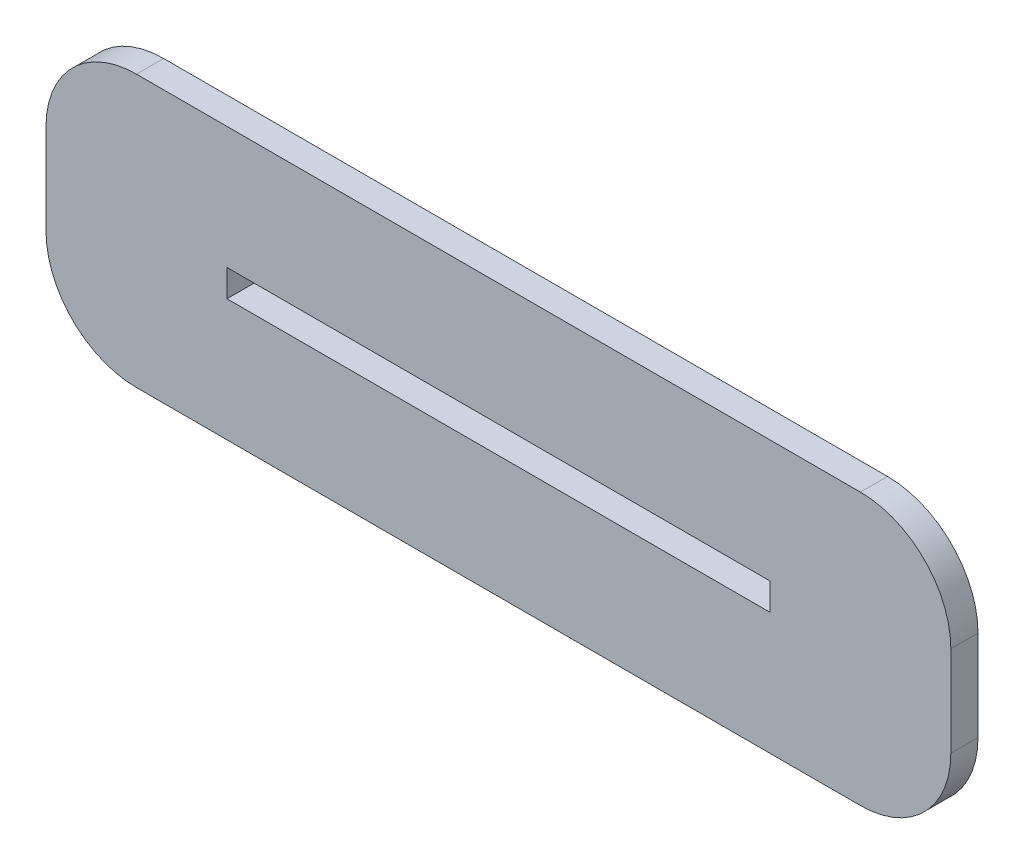
ISO-10303-21;
HEADER;
FILE_DESCRIPTION(('STEP AP214'),'2;1');
FILE_NAME('part.step','',(''),(''),'','','');
FILE_SCHEMA(('AUTOMOTIVE_DESIGN { 1 0 10303 214 1 1 1 1 }'));
ENDSEC;
DATA;
#1=APPLICATION_CONTEXT('core data for automotive mechanical design processes');
#2=APPLICATION_PROTOCOL_DEFINITION('international standard','automotive_design',2000,#1);
#3=PRODUCT_CONTEXT('',#1,'mechanical');
#4=PRODUCT('Part','Part','',(#3));
#5=PRODUCT_RELATED_PRODUCT_CATEGORY('part','',(#4));
#6=PRODUCT_DEFINITION_FORMATION('','',#4);
#7=PRODUCT_DEFINITION_CONTEXT('part definition',#1,'design');
#8=PRODUCT_DEFINITION('design','',#6,#7);
#9=PRODUCT_DEFINITION_SHAPE('','',#8);
#10=(LENGTH_UNIT() NAMED_UNIT(*) SI_UNIT(.MILLI.,.METRE.));
#11=(NAMED_UNIT(*) PLANE_ANGLE_UNIT() SI_UNIT($,.RADIAN.));
#12=(NAMED_UNIT(*) SI_UNIT($,.STERADIAN.) SOLID_ANGLE_UNIT());
#13=UNCERTAINTY_MEASURE_WITH_UNIT(LENGTH_MEASURE(1.E-05),#10,'distance_accuracy_value','');
#14=(GEOMETRIC_REPRESENTATION_CONTEXT(3) GLOBAL_UNCERTAINTY_ASSIGNED_CONTEXT((#13)) GLOBAL_UNIT_ASSIGNED_CONTEXT((#10,
#11,#12)) REPRESENTATION_CONTEXT('',''));
#15=CARTESIAN_POINT('',(0.,0.,0.));
#16=DIRECTION('',(0.,0.,1.));
#17=DIRECTION('',(1.,0.,0.));
#18=AXIS2_PLACEMENT_3D('',#15,#16,#17);
#19=CARTESIAN_POINT('',(0.,30.,3.));
#20=DIRECTION('',(0.,0.,-1.));
#21=DIRECTION('',(-1.,0.,0.));
#22=AXIS2_PLACEMENT_3D('',#19,#20,#21);
#23=PLANE('',#22);
#24=DIRECTION('',(-1.,0.,0.));
#25=VECTOR('',#24,1.);
#26=CARTESIAN_POINT('',(0.,30.,3.));
#27=LINE('',#26,#25);
#28=CARTESIAN_POINT('',(90.,30.,3.));
#29=VERTEX_POINT('',#28);
#30=CARTESIAN_POINT('',(10.,30.,3.));
#31=VERTEX_POINT('',#30);
#32=EDGE_CURVE('E171',#29,#31,#27,.T.);
#33=ORIENTED_EDGE('',*,*,#32,.T.);
#34=CARTESIAN_POINT('',(10.,20.,3.));
#35=DIRECTION('',(0.,0.,-1.));
#36=DIRECTION('',(-1.,0.,0.));
#37=AXIS2_PLACEMENT_3D('',#34,#35,#36);
#38=CIRCLE('',#37,10.);
#39=CARTESIAN_POINT('',(0.,20.,3.));
#40=VERTEX_POINT('',#39);
#41=EDGE_CURVE('E206',#31,#40,#38,.F.);
#42=ORIENTED_EDGE('',*,*,#41,.T.);
#43=DIRECTION('',(0.,-1.,0.));
#44=VECTOR('',#43,1.);
#45=CARTESIAN_POINT('',(0.,0.,3.));
#46=LINE('',#45,#44);
#47=CARTESIAN_POINT('',(0.,10.,3.));
#48=VERTEX_POINT('',#47);
#49=EDGE_CURVE('E163',#40,#48,#46,.T.);
#50=ORIENTED_EDGE('',*,*,#49,.T.);
#51=CARTESIAN_POINT('',(10.,10.,3.));
#52=DIRECTION('',(0.,0.,-1.));
#53=DIRECTION('',(-1.,0.,0.));
#54=AXIS2_PLACEMENT_3D('',#51,#52,#53);
#55=CIRCLE('',#54,10.);
#56=CARTESIAN_POINT('',(10.,0.,3.));
#57=VERTEX_POINT('',#56);
#58=EDGE_CURVE('E204',#48,#57,#55,.F.);
#59=ORIENTED_EDGE('',*,*,#58,.T.);
#60=DIRECTION('',(1.,0.,0.));
#61=VECTOR('',#60,1.);
#62=CARTESIAN_POINT('',(0.,0.,3.));
#63=LINE('',#62,#61);
#64=CARTESIAN_POINT('',(90.,0.,3.));
#65=VERTEX_POINT('',#64);
#66=EDGE_CURVE('E166',#57,#65,#63,.T.);
#67=ORIENTED_EDGE('',*,*,#66,.T.);
#68=CARTESIAN_POINT('',(90.,10.,3.));
#69=DIRECTION('',(0.,0.,-1.));
#70=DIRECTION('',(-1.,0.,0.));
#71=AXIS2_PLACEMENT_3D('',#68,#69,#70);
#72=CIRCLE('',#71,10.);
#73=CARTESIAN_POINT('',(100.,10.,3.));
#74=VERTEX_POINT('',#73);
#75=EDGE_CURVE('E52',#65,#74,#72,.F.);
#76=ORIENTED_EDGE('',*,*,#75,.T.);
#77=DIRECTION('',(0.,1.,0.));
#78=VECTOR('',#77,1.);
#79=CARTESIAN_POINT('',(100.,0.,3.));
#80=LINE('',#79,#78);
#81=CARTESIAN_POINT('',(100.,20.,3.));
#82=VERTEX_POINT('',#81);
#83=EDGE_CURVE('E169',#74,#82,#80,.T.);
#84=ORIENTED_EDGE('',*,*,#83,.T.);
#85=CARTESIAN_POINT('',(90.,20.,3.));
#86=DIRECTION('',(0.,0.,-1.));
#87=DIRECTION('',(-1.,0.,0.));
#88=AXIS2_PLACEMENT_3D('',#85,#86,#87);
#89=CIRCLE('',#88,10.);
#90=EDGE_CURVE('E201',#82,#29,#89,.F.);
#91=ORIENTED_EDGE('',*,*,#90,.T.);
#92=EDGE_LOOP('',(#33,#42,#50,#59,#67,#76,#84,#91));
#93=FACE_BOUND('',#92,.T.);
#94=DIRECTION('',(0.,1.,0.));
#95=VECTOR('',#94,1.);
#96=CARTESIAN_POINT('',(80.,13.5,3.));
#97=LINE('',#96,#95);
#98=CARTESIAN_POINT('',(80.,13.5,3.));
#99=VERTEX_POINT('',#98);
#100=CARTESIAN_POINT('',(80.,16.5,3.));
#101=VERTEX_POINT('',#100);
#102=EDGE_CURVE('E122',#99,#101,#97,.T.);
#103=ORIENTED_EDGE('',*,*,#102,.F.);
#104=DIRECTION('',(1.,0.,0.));
#105=VECTOR('',#104,1.);
#106=CARTESIAN_POINT('',(20.,13.5,3.));
#107=LINE('',#106,#105);
#108=CARTESIAN_POINT('',(20.,13.5,3.));
#109=VERTEX_POINT('',#108);
#110=EDGE_CURVE('E147',#109,#99,#107,.T.);
#111=ORIENTED_EDGE('',*,*,#110,.F.);
#112=DIRECTION('',(0.,-1.,0.));
#113=VECTOR('',#112,1.);
#114=CARTESIAN_POINT('',(20.,13.5,3.));
#115=LINE('',#114,#113);
#116=CARTESIAN_POINT('',(20.,16.5,3.));
#117=VERTEX_POINT('',#116);
#118=EDGE_CURVE('E145',#117,#109,#115,.T.);
#119=ORIENTED_EDGE('',*,*,#118,.F.);
#120=DIRECTION('',(-1.,0.,0.));
#121=VECTOR('',#120,1.);
#122=CARTESIAN_POINT('',(20.,16.5,3.));
#123=LINE('',#122,#121);
#124=EDGE_CURVE('E132',#101,#117,#123,.T.);
#125=ORIENTED_EDGE('',*,*,#124,.F.);
#126=EDGE_LOOP('',(#103,#111,#119,#125));
#127=FACE_BOUND('',#126,.T.);
#128=ADVANCED_FACE('F31',(#93,#127),#23,.F.);
#129=CARTESIAN_POINT('',(0.,30.,0.));
#130=DIRECTION('',(0.,0.,-1.));
#131=DIRECTION('',(-1.,0.,0.));
#132=AXIS2_PLACEMENT_3D('',#129,#130,#131);
#133=PLANE('',#132);
#134=DIRECTION('',(0.,-1.,0.));
#135=VECTOR('',#134,1.);
#136=CARTESIAN_POINT('',(0.,0.,0.));
#137=LINE('',#136,#135);
#138=CARTESIAN_POINT('',(0.,20.,0.));
#139=VERTEX_POINT('',#138);
#140=CARTESIAN_POINT('',(0.,10.,0.));
#141=VERTEX_POINT('',#140);
#142=EDGE_CURVE('E140',#139,#141,#137,.T.);
#143=ORIENTED_EDGE('',*,*,#142,.F.);
#144=CARTESIAN_POINT('',(10.,20.,0.));
#145=DIRECTION('',(0.,0.,-1.));
#146=DIRECTION('',(-1.,0.,0.));
#147=AXIS2_PLACEMENT_3D('',#144,#145,#146);
#148=CIRCLE('',#147,10.);
#149=CARTESIAN_POINT('',(10.,30.,0.));
#150=VERTEX_POINT('',#149);
#151=EDGE_CURVE('E194',#139,#150,#148,.T.);
#152=ORIENTED_EDGE('',*,*,#151,.T.);
#153=DIRECTION('',(-1.,0.,0.));
#154=VECTOR('',#153,1.);
#155=CARTESIAN_POINT('',(0.,30.,0.));
#156=LINE('',#155,#154);
#157=CARTESIAN_POINT('',(90.,30.,0.));
#158=VERTEX_POINT('',#157);
#159=EDGE_CURVE('E167',#158,#150,#156,.T.);
#160=ORIENTED_EDGE('',*,*,#159,.F.);
#161=CARTESIAN_POINT('',(90.,20.,0.));
#162=DIRECTION('',(0.,0.,-1.));
#163=DIRECTION('',(-1.,0.,0.));
#164=AXIS2_PLACEMENT_3D('',#161,#162,#163);
#165=CIRCLE('',#164,10.);
#166=CARTESIAN_POINT('',(100.,20.,0.));
#167=VERTEX_POINT('',#166);
#168=EDGE_CURVE('E188',#158,#167,#165,.T.);
#169=ORIENTED_EDGE('',*,*,#168,.T.);
#170=DIRECTION('',(0.,1.,0.));
#171=VECTOR('',#170,1.);
#172=CARTESIAN_POINT('',(100.,0.,0.));
#173=LINE('',#172,#171);
#174=CARTESIAN_POINT('',(100.,10.,0.));
#175=VERTEX_POINT('',#174);
#176=EDGE_CURVE('E180',#175,#167,#173,.T.);
#177=ORIENTED_EDGE('',*,*,#176,.F.);
#178=CARTESIAN_POINT('',(90.,10.,0.));
#179=DIRECTION('',(0.,0.,-1.));
#180=DIRECTION('',(-1.,0.,0.));
#181=AXIS2_PLACEMENT_3D('',#178,#179,#180);
#182=CIRCLE('',#181,10.);
#183=CARTESIAN_POINT('',(90.,0.,0.));
#184=VERTEX_POINT('',#183);
#185=EDGE_CURVE('E190',#175,#184,#182,.T.);
#186=ORIENTED_EDGE('',*,*,#185,.T.);
#187=DIRECTION('',(1.,0.,0.));
#188=VECTOR('',#187,1.);
#189=CARTESIAN_POINT('',(0.,0.,0.));
#190=LINE('',#189,#188);
#191=CARTESIAN_POINT('',(10.,0.,0.));
#192=VERTEX_POINT('',#191);
#193=EDGE_CURVE('E177',#192,#184,#190,.T.);
#194=ORIENTED_EDGE('',*,*,#193,.F.);
#195=CARTESIAN_POINT('',(10.,10.,0.));
#196=DIRECTION('',(0.,0.,-1.));
#197=DIRECTION('',(-1.,0.,0.));
#198=AXIS2_PLACEMENT_3D('',#195,#196,#197);
#199=CIRCLE('',#198,10.);
#200=EDGE_CURVE('E192',#192,#141,#199,.T.);
#201=ORIENTED_EDGE('',*,*,#200,.T.);
#202=EDGE_LOOP('',(#143,#152,#160,#169,#177,#186,#194,#201));
#203=FACE_BOUND('',#202,.T.);
#204=DIRECTION('',(1.,0.,0.));
#205=VECTOR('',#204,1.);
#206=CARTESIAN_POINT('',(20.,13.5,0.));
#207=LINE('',#206,#205);
#208=CARTESIAN_POINT('',(20.,13.5,0.));
#209=VERTEX_POINT('',#208);
#210=CARTESIAN_POINT('',(80.,13.5,0.));
#211=VERTEX_POINT('',#210);
#212=EDGE_CURVE('E133',#209,#211,#207,.T.);
#213=ORIENTED_EDGE('',*,*,#212,.T.);
#214=DIRECTION('',(0.,1.,0.));
#215=VECTOR('',#214,1.);
#216=CARTESIAN_POINT('',(80.,13.5,0.));
#217=LINE('',#216,#215);
#218=CARTESIAN_POINT('',(80.,16.5,0.));
#219=VERTEX_POINT('',#218);
#220=EDGE_CURVE('E151',#211,#219,#217,.T.);
#221=ORIENTED_EDGE('',*,*,#220,.T.);
#222=DIRECTION('',(-1.,0.,0.));
#223=VECTOR('',#222,1.);
#224=CARTESIAN_POINT('',(20.,16.5,0.));
#225=LINE('',#224,#223);
#226=CARTESIAN_POINT('',(20.,16.5,0.));
#227=VERTEX_POINT('',#226);
#228=EDGE_CURVE('E139',#219,#227,#225,.T.);
#229=ORIENTED_EDGE('',*,*,#228,.T.);
#230=DIRECTION('',(0.,-1.,0.));
#231=VECTOR('',#230,1.);
#232=CARTESIAN_POINT('',(20.,13.5,0.));
#233=LINE('',#232,#231);
#234=EDGE_CURVE('E154',#227,#209,#233,.T.);
#235=ORIENTED_EDGE('',*,*,#234,.T.);
#236=EDGE_LOOP('',(#213,#221,#229,#235));
#237=FACE_BOUND('',#236,.T.);
#238=ADVANCED_FACE('F222',(#203,#237),#133,.T.);
#239=CARTESIAN_POINT('',(0.,0.,3.));
#240=DIRECTION('',(1.,0.,0.));
#241=DIRECTION('',(0.,0.,-1.));
#242=AXIS2_PLACEMENT_3D('',#239,#240,#241);
#243=PLANE('',#242);
#244=ORIENTED_EDGE('',*,*,#49,.F.);
#245=DIRECTION('',(0.,0.,-1.));
#246=VECTOR('',#245,1.);
#247=CARTESIAN_POINT('',(0.,20.,3.));
#248=LINE('',#247,#246);
#249=EDGE_CURVE('E185',#40,#139,#248,.T.);
#250=ORIENTED_EDGE('',*,*,#249,.T.);
#251=ORIENTED_EDGE('',*,*,#142,.T.);
#252=DIRECTION('',(0.,0.,-1.));
#253=VECTOR('',#252,1.);
#254=CARTESIAN_POINT('',(0.,10.,3.));
#255=LINE('',#254,#253);
#256=EDGE_CURVE('E174',#141,#48,#255,.F.);
#257=ORIENTED_EDGE('',*,*,#256,.T.);
#258=EDGE_LOOP('',(#244,#250,#251,#257));
#259=FACE_BOUND('',#258,.T.);
#260=ADVANCED_FACE('F243',(#259),#243,.F.);
#261=CARTESIAN_POINT('',(0.,0.,3.));
#262=DIRECTION('',(0.,1.,0.));
#263=DIRECTION('',(0.,0.,1.));
#264=AXIS2_PLACEMENT_3D('',#261,#262,#263);
#265=PLANE('',#264);
#266=ORIENTED_EDGE('',*,*,#66,.F.);
#267=DIRECTION('',(0.,0.,-1.));
#268=VECTOR('',#267,1.);
#269=CARTESIAN_POINT('',(10.,0.,3.));
#270=LINE('',#269,#268);
#271=EDGE_CURVE('E210',#57,#192,#270,.T.);
#272=ORIENTED_EDGE('',*,*,#271,.T.);
#273=ORIENTED_EDGE('',*,*,#193,.T.);
#274=DIRECTION('',(0.,0.,-1.));
#275=VECTOR('',#274,1.);
#276=CARTESIAN_POINT('',(90.,0.,3.));
#277=LINE('',#276,#275);
#278=EDGE_CURVE('E208',#184,#65,#277,.F.);
#279=ORIENTED_EDGE('',*,*,#278,.T.);
#280=EDGE_LOOP('',(#266,#272,#273,#279));
#281=FACE_BOUND('',#280,.T.);
#282=ADVANCED_FACE('F216',(#281),#265,.F.);
#283=CARTESIAN_POINT('',(100.,0.,3.));
#284=DIRECTION('',(-1.,0.,0.));
#285=DIRECTION('',(0.,0.,1.));
#286=AXIS2_PLACEMENT_3D('',#283,#284,#285);
#287=PLANE('',#286);
#288=ORIENTED_EDGE('',*,*,#83,.F.);
#289=DIRECTION('',(0.,0.,-1.));
#290=VECTOR('',#289,1.);
#291=CARTESIAN_POINT('',(100.,10.,3.));
#292=LINE('',#291,#290);
#293=EDGE_CURVE('E11',#74,#175,#292,.T.);
#294=ORIENTED_EDGE('',*,*,#293,.T.);
#295=ORIENTED_EDGE('',*,*,#176,.T.);
#296=DIRECTION('',(0.,0.,-1.));
#297=VECTOR('',#296,1.);
#298=CARTESIAN_POINT('',(100.,20.,3.));
#299=LINE('',#298,#297);
#300=EDGE_CURVE('E39',#167,#82,#299,.F.);
#301=ORIENTED_EDGE('',*,*,#300,.T.);
#302=EDGE_LOOP('',(#288,#294,#295,#301));
#303=FACE_BOUND('',#302,.T.);
#304=ADVANCED_FACE('F228',(#303),#287,.F.);
#305=CARTESIAN_POINT('',(0.,30.,3.));
#306=DIRECTION('',(0.,-1.,0.));
#307=DIRECTION('',(0.,0.,-1.));
#308=AXIS2_PLACEMENT_3D('',#305,#306,#307);
#309=PLANE('',#308);
#310=ORIENTED_EDGE('',*,*,#159,.T.);
#311=DIRECTION('',(0.,0.,-1.));
#312=VECTOR('',#311,1.);
#313=CARTESIAN_POINT('',(10.,30.,3.));
#314=LINE('',#313,#312);
#315=EDGE_CURVE('E199',#150,#31,#314,.F.);
#316=ORIENTED_EDGE('',*,*,#315,.T.);
#317=ORIENTED_EDGE('',*,*,#32,.F.);
#318=DIRECTION('',(0.,0.,-1.));
#319=VECTOR('',#318,1.);
#320=CARTESIAN_POINT('',(90.,30.,3.));
#321=LINE('',#320,#319);
#322=EDGE_CURVE('E196',#29,#158,#321,.T.);
#323=ORIENTED_EDGE('',*,*,#322,.T.);
#324=EDGE_LOOP('',(#310,#316,#317,#323));
#325=FACE_BOUND('',#324,.T.);
#326=ADVANCED_FACE('F235',(#325),#309,.F.);
#327=CARTESIAN_POINT('',(80.,13.5,3.));
#328=DIRECTION('',(-1.,0.,0.));
#329=DIRECTION('',(0.,0.,1.));
#330=AXIS2_PLACEMENT_3D('',#327,#328,#329);
#331=PLANE('',#330);
#332=ORIENTED_EDGE('',*,*,#220,.F.);
#333=DIRECTION('',(0.,0.,-1.));
#334=VECTOR('',#333,1.);
#335=CARTESIAN_POINT('',(80.,13.5,3.));
#336=LINE('',#335,#334);
#337=EDGE_CURVE('E128',#99,#211,#336,.T.);
#338=ORIENTED_EDGE('',*,*,#337,.F.);
#339=ORIENTED_EDGE('',*,*,#102,.T.);
#340=DIRECTION('',(0.,0.,-1.));
#341=VECTOR('',#340,1.);
#342=CARTESIAN_POINT('',(80.,16.5,3.));
#343=LINE('',#342,#341);
#344=EDGE_CURVE('E125',#101,#219,#343,.T.);
#345=ORIENTED_EDGE('',*,*,#344,.T.);
#346=EDGE_LOOP('',(#332,#338,#339,#345));
#347=FACE_BOUND('',#346,.T.);
#348=ADVANCED_FACE('F124',(#347),#331,.T.);
#349=CARTESIAN_POINT('',(20.,16.5,3.));
#350=DIRECTION('',(0.,-1.,0.));
#351=DIRECTION('',(1.,0.,0.));
#352=AXIS2_PLACEMENT_3D('',#349,#350,#351);
#353=PLANE('',#352);
#354=ORIENTED_EDGE('',*,*,#228,.F.);
#355=ORIENTED_EDGE('',*,*,#344,.F.);
#356=ORIENTED_EDGE('',*,*,#124,.T.);
#357=DIRECTION('',(0.,0.,-1.));
#358=VECTOR('',#357,1.);
#359=CARTESIAN_POINT('',(20.,16.5,3.));
#360=LINE('',#359,#358);
#361=EDGE_CURVE('E141',#117,#227,#360,.T.);
#362=ORIENTED_EDGE('',*,*,#361,.T.);
#363=EDGE_LOOP('',(#354,#355,#356,#362));
#364=FACE_BOUND('',#363,.T.);
#365=ADVANCED_FACE('F136',(#364),#353,.T.);
#366=CARTESIAN_POINT('',(20.,13.5,3.));
#367=DIRECTION('',(1.,0.,0.));
#368=DIRECTION('',(0.,0.,-1.));
#369=AXIS2_PLACEMENT_3D('',#366,#367,#368);
#370=PLANE('',#369);
#371=ORIENTED_EDGE('',*,*,#234,.F.);
#372=ORIENTED_EDGE('',*,*,#361,.F.);
#373=ORIENTED_EDGE('',*,*,#118,.T.);
#374=DIRECTION('',(0.,0.,-1.));
#375=VECTOR('',#374,1.);
#376=CARTESIAN_POINT('',(20.,13.5,3.));
#377=LINE('',#376,#375);
#378=EDGE_CURVE('E160',#109,#209,#377,.T.);
#379=ORIENTED_EDGE('',*,*,#378,.T.);
#380=EDGE_LOOP('',(#371,#372,#373,#379));
#381=FACE_BOUND('',#380,.T.);
#382=ADVANCED_FACE('F298',(#381),#370,.T.);
#383=CARTESIAN_POINT('',(20.,13.5,3.));
#384=DIRECTION('',(0.,1.,0.));
#385=DIRECTION('',(-1.,0.,0.));
#386=AXIS2_PLACEMENT_3D('',#383,#384,#385);
#387=PLANE('',#386);
#388=ORIENTED_EDGE('',*,*,#212,.F.);
#389=ORIENTED_EDGE('',*,*,#378,.F.);
#390=ORIENTED_EDGE('',*,*,#110,.T.);
#391=ORIENTED_EDGE('',*,*,#337,.T.);
#392=EDGE_LOOP('',(#388,#389,#390,#391));
#393=FACE_BOUND('',#392,.T.);
#394=ADVANCED_FACE('F252',(#393),#387,.T.);
#395=CARTESIAN_POINT('',(10.,20.,3.));
#396=DIRECTION('',(0.,0.,-1.));
#397=DIRECTION('',(-1.,0.,0.));
#398=AXIS2_PLACEMENT_3D('',#395,#396,#397);
#399=CYLINDRICAL_SURFACE('',#398,10.);
#400=ORIENTED_EDGE('',*,*,#41,.F.);
#401=ORIENTED_EDGE('',*,*,#315,.F.);
#402=ORIENTED_EDGE('',*,*,#151,.F.);
#403=ORIENTED_EDGE('',*,*,#249,.F.);
#404=EDGE_LOOP('',(#400,#401,#402,#403));
#405=FACE_BOUND('',#404,.T.);
#406=ADVANCED_FACE('F240',(#405),#399,.T.);
#407=CARTESIAN_POINT('',(10.,10.,3.));
#408=DIRECTION('',(0.,0.,-1.));
#409=DIRECTION('',(-1.,0.,0.));
#410=AXIS2_PLACEMENT_3D('',#407,#408,#409);
#411=CYLINDRICAL_SURFACE('',#410,10.);
#412=ORIENTED_EDGE('',*,*,#58,.F.);
#413=ORIENTED_EDGE('',*,*,#256,.F.);
#414=ORIENTED_EDGE('',*,*,#200,.F.);
#415=ORIENTED_EDGE('',*,*,#271,.F.);
#416=EDGE_LOOP('',(#412,#413,#414,#415));
#417=FACE_BOUND('',#416,.T.);
#418=ADVANCED_FACE('F245',(#417),#411,.T.);
#419=CARTESIAN_POINT('',(90.,10.,3.));
#420=DIRECTION('',(0.,0.,-1.));
#421=DIRECTION('',(-1.,0.,0.));
#422=AXIS2_PLACEMENT_3D('',#419,#420,#421);
#423=CYLINDRICAL_SURFACE('',#422,10.);
#424=ORIENTED_EDGE('',*,*,#75,.F.);
#425=ORIENTED_EDGE('',*,*,#278,.F.);
#426=ORIENTED_EDGE('',*,*,#185,.F.);
#427=ORIENTED_EDGE('',*,*,#293,.F.);
#428=EDGE_LOOP('',(#424,#425,#426,#427));
#429=FACE_BOUND('',#428,.T.);
#430=ADVANCED_FACE('F227',(#429),#423,.T.);
#431=CARTESIAN_POINT('',(90.,20.,3.));
#432=DIRECTION('',(0.,0.,-1.));
#433=DIRECTION('',(-1.,0.,0.));
#434=AXIS2_PLACEMENT_3D('',#431,#432,#433);
#435=CYLINDRICAL_SURFACE('',#434,10.);
#436=ORIENTED_EDGE('',*,*,#90,.F.);
#437=ORIENTED_EDGE('',*,*,#300,.F.);
#438=ORIENTED_EDGE('',*,*,#168,.F.);
#439=ORIENTED_EDGE('',*,*,#322,.F.);
#440=EDGE_LOOP('',(#436,#437,#438,#439));
#441=FACE_BOUND('',#440,.T.);
#442=ADVANCED_FACE('F33',(#441),#435,.T.);
#443=CLOSED_SHELL('',(#128,#238,#260,#282,#304,#326,#348,#365,#382,#394,#406,#418,#430,#442));
#444=MANIFOLD_SOLID_BREP('B2',#443);
#445=ADVANCED_BREP_SHAPE_REPRESENTATION('',(#18,#444),#14);
#446=SHAPE_DEFINITION_REPRESENTATION(#9,#445);
ENDSEC;
END-ISO-10303-21;
